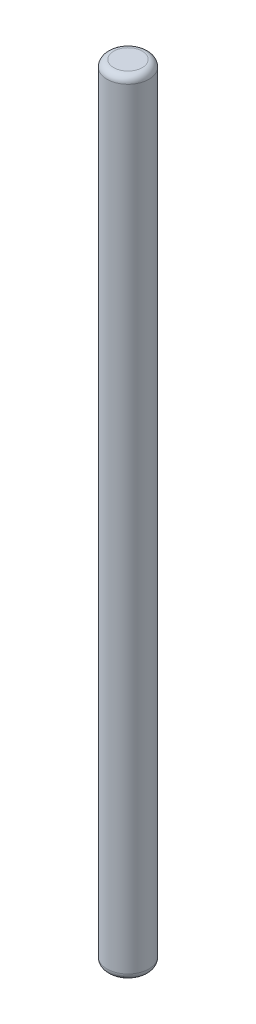
ISO-10303-21;
HEADER;
FILE_DESCRIPTION(('STEP AP214'),'2;1');
FILE_NAME('part.step','',(''),(''),'','','');
FILE_SCHEMA(('AUTOMOTIVE_DESIGN { 1 0 10303 214 1 1 1 1 }'));
ENDSEC;
DATA;
#1=APPLICATION_CONTEXT('core data for automotive mechanical design processes');
#2=APPLICATION_PROTOCOL_DEFINITION('international standard','automotive_design',2000,#1);
#3=PRODUCT_CONTEXT('',#1,'mechanical');
#4=PRODUCT('Part','Part','',(#3));
#5=PRODUCT_RELATED_PRODUCT_CATEGORY('part','',(#4));
#6=PRODUCT_DEFINITION_FORMATION('','',#4);
#7=PRODUCT_DEFINITION_CONTEXT('part definition',#1,'design');
#8=PRODUCT_DEFINITION('design','',#6,#7);
#9=PRODUCT_DEFINITION_SHAPE('','',#8);
#10=(LENGTH_UNIT() NAMED_UNIT(*) SI_UNIT(.MILLI.,.METRE.));
#11=(NAMED_UNIT(*) PLANE_ANGLE_UNIT() SI_UNIT($,.RADIAN.));
#12=(NAMED_UNIT(*) SI_UNIT($,.STERADIAN.) SOLID_ANGLE_UNIT());
#13=UNCERTAINTY_MEASURE_WITH_UNIT(LENGTH_MEASURE(1.E-05),#10,'distance_accuracy_value','');
#14=(GEOMETRIC_REPRESENTATION_CONTEXT(3) GLOBAL_UNCERTAINTY_ASSIGNED_CONTEXT((#13)) GLOBAL_UNIT_ASSIGNED_CONTEXT((#10,
#11,#12)) REPRESENTATION_CONTEXT('',''));
#15=CARTESIAN_POINT('',(0.,0.,0.));
#16=DIRECTION('',(0.,0.,1.));
#17=DIRECTION('',(1.,0.,0.));
#18=AXIS2_PLACEMENT_3D('',#15,#16,#17);
#19=CARTESIAN_POINT('',(0.,88.9,0.));
#20=DIRECTION('',(0.,-1.,0.));
#21=DIRECTION('',(0.,0.,-1.));
#22=AXIS2_PLACEMENT_3D('',#19,#20,#21);
#23=CYLINDRICAL_SURFACE('',#22,2.38125);
#24=CARTESIAN_POINT('',(0.,0.761999999999999,0.));
#25=DIRECTION('',(0.,1.,0.));
#26=DIRECTION('',(0.,0.,1.));
#27=AXIS2_PLACEMENT_3D('',#24,#25,#26);
#28=CIRCLE('',#27,2.38125);
#29=CARTESIAN_POINT('',(0.,0.761999999999999,2.38125));
#30=VERTEX_POINT('',#29);
#31=EDGE_CURVE('E42',#30,#30,#28,.T.);
#32=ORIENTED_EDGE('',*,*,#31,.T.);
#33=EDGE_LOOP('',(#32));
#34=FACE_BOUND('',#33,.T.);
#35=CARTESIAN_POINT('',(0.,88.138,0.));
#36=DIRECTION('',(0.,1.,0.));
#37=DIRECTION('',(0.,0.,1.));
#38=AXIS2_PLACEMENT_3D('',#35,#36,#37);
#39=CIRCLE('',#38,2.38125);
#40=CARTESIAN_POINT('',(0.,88.138,2.38125));
#41=VERTEX_POINT('',#40);
#42=EDGE_CURVE('E46',#41,#41,#39,.F.);
#43=ORIENTED_EDGE('',*,*,#42,.T.);
#44=EDGE_LOOP('',(#43));
#45=FACE_BOUND('',#44,.T.);
#46=ADVANCED_FACE('F31',(#34,#45),#23,.T.);
#47=CARTESIAN_POINT('',(0.,88.9,0.));
#48=DIRECTION('',(0.,1.,0.));
#49=DIRECTION('',(0.,0.,1.));
#50=AXIS2_PLACEMENT_3D('',#47,#48,#49);
#51=PLANE('',#50);
#52=CARTESIAN_POINT('',(0.,88.9,0.));
#53=DIRECTION('',(0.,1.,0.));
#54=DIRECTION('',(0.,0.,1.));
#55=AXIS2_PLACEMENT_3D('',#52,#53,#54);
#56=CIRCLE('',#55,1.61925);
#57=CARTESIAN_POINT('',(0.,88.9,1.61925));
#58=VERTEX_POINT('',#57);
#59=EDGE_CURVE('E10',#58,#58,#56,.T.);
#60=ORIENTED_EDGE('',*,*,#59,.T.);
#61=EDGE_LOOP('',(#60));
#62=FACE_BOUND('',#61,.T.);
#63=ADVANCED_FACE('F62',(#62),#51,.T.);
#64=CARTESIAN_POINT('',(0.,0.,0.));
#65=DIRECTION('',(0.,1.,0.));
#66=DIRECTION('',(0.,0.,1.));
#67=AXIS2_PLACEMENT_3D('',#64,#65,#66);
#68=PLANE('',#67);
#69=CARTESIAN_POINT('',(0.,0.,0.));
#70=DIRECTION('',(0.,1.,0.));
#71=DIRECTION('',(0.,0.,1.));
#72=AXIS2_PLACEMENT_3D('',#69,#70,#71);
#73=CIRCLE('',#72,1.61925);
#74=CARTESIAN_POINT('',(0.,0.,1.61925));
#75=VERTEX_POINT('',#74);
#76=EDGE_CURVE('E38',#75,#75,#73,.F.);
#77=ORIENTED_EDGE('',*,*,#76,.T.);
#78=EDGE_LOOP('',(#77));
#79=FACE_BOUND('',#78,.T.);
#80=ADVANCED_FACE('F59',(#79),#68,.F.);
#81=CARTESIAN_POINT('',(0.,0.761999999999999,0.));
#82=DIRECTION('',(0.,1.,0.));
#83=DIRECTION('',(0.,0.,1.));
#84=AXIS2_PLACEMENT_3D('',#81,#82,#83);
#85=TOROIDAL_SURFACE('',#84,1.61925,0.762);
#86=ORIENTED_EDGE('',*,*,#76,.F.);
#87=EDGE_LOOP('',(#86));
#88=FACE_BOUND('',#87,.T.);
#89=ORIENTED_EDGE('',*,*,#31,.F.);
#90=EDGE_LOOP('',(#89));
#91=FACE_BOUND('',#90,.T.);
#92=ADVANCED_FACE('F55',(#88,#91),#85,.T.);
#93=CARTESIAN_POINT('',(0.,88.138,0.));
#94=DIRECTION('',(0.,1.,0.));
#95=DIRECTION('',(0.,0.,1.));
#96=AXIS2_PLACEMENT_3D('',#93,#94,#95);
#97=TOROIDAL_SURFACE('',#96,1.61925,0.762);
#98=ORIENTED_EDGE('',*,*,#42,.F.);
#99=EDGE_LOOP('',(#98));
#100=FACE_BOUND('',#99,.T.);
#101=ORIENTED_EDGE('',*,*,#59,.F.);
#102=EDGE_LOOP('',(#101));
#103=FACE_BOUND('',#102,.T.);
#104=ADVANCED_FACE('F33',(#100,#103),#97,.T.);
#105=CLOSED_SHELL('',(#46,#63,#80,#92,#104));
#106=MANIFOLD_SOLID_BREP('B2',#105);
#107=ADVANCED_BREP_SHAPE_REPRESENTATION('',(#18,#106),#14);
#108=SHAPE_DEFINITION_REPRESENTATION(#9,#107);
ENDSEC;
END-ISO-10303-21;
